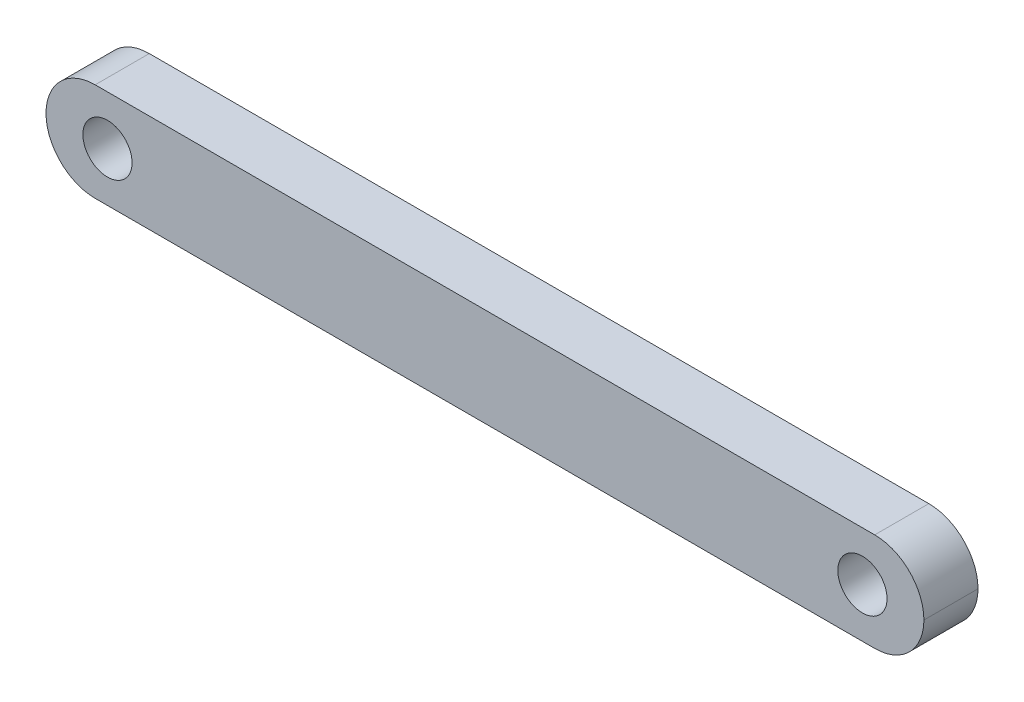
ISO-10303-21;
HEADER;
FILE_DESCRIPTION(('STEP AP214'),'2;1');
FILE_NAME('part.step','',(''),(''),'','','');
FILE_SCHEMA(('AUTOMOTIVE_DESIGN { 1 0 10303 214 1 1 1 1 }'));
ENDSEC;
DATA;
#1=APPLICATION_CONTEXT('core data for automotive mechanical design processes');
#2=APPLICATION_PROTOCOL_DEFINITION('international standard','automotive_design',2000,#1);
#3=PRODUCT_CONTEXT('',#1,'mechanical');
#4=PRODUCT('Part','Part','',(#3));
#5=PRODUCT_RELATED_PRODUCT_CATEGORY('part','',(#4));
#6=PRODUCT_DEFINITION_FORMATION('','',#4);
#7=PRODUCT_DEFINITION_CONTEXT('part definition',#1,'design');
#8=PRODUCT_DEFINITION('design','',#6,#7);
#9=PRODUCT_DEFINITION_SHAPE('','',#8);
#10=(LENGTH_UNIT() NAMED_UNIT(*) SI_UNIT(.MILLI.,.METRE.));
#11=(NAMED_UNIT(*) PLANE_ANGLE_UNIT() SI_UNIT($,.RADIAN.));
#12=(NAMED_UNIT(*) SI_UNIT($,.STERADIAN.) SOLID_ANGLE_UNIT());
#13=UNCERTAINTY_MEASURE_WITH_UNIT(LENGTH_MEASURE(1.E-05),#10,'distance_accuracy_value','');
#14=(GEOMETRIC_REPRESENTATION_CONTEXT(3) GLOBAL_UNCERTAINTY_ASSIGNED_CONTEXT((#13)) GLOBAL_UNIT_ASSIGNED_CONTEXT((#10,
#11,#12)) REPRESENTATION_CONTEXT('',''));
#15=CARTESIAN_POINT('',(0.,0.,0.));
#16=DIRECTION('',(0.,0.,1.));
#17=DIRECTION('',(1.,0.,0.));
#18=AXIS2_PLACEMENT_3D('',#15,#16,#17);
#19=CARTESIAN_POINT('',(0.,0.,2.2));
#20=DIRECTION('',(0.,0.,1.));
#21=DIRECTION('',(1.,0.,0.));
#22=AXIS2_PLACEMENT_3D('',#19,#20,#21);
#23=PLANE('',#22);
#24=CARTESIAN_POINT('',(-59.8477644666667,10.4166666666667,2.2));
#25=DIRECTION('',(0.,0.,1.));
#26=DIRECTION('',(1.,0.,0.));
#27=AXIS2_PLACEMENT_3D('',#24,#25,#26);
#28=CIRCLE('',#27,0.999999999999998);
#29=CARTESIAN_POINT('',(-58.8477644666667,10.4166666666667,2.2));
#30=VERTEX_POINT('',#29);
#31=EDGE_CURVE('E125',#30,#30,#28,.T.);
#32=ORIENTED_EDGE('',*,*,#31,.F.);
#33=EDGE_LOOP('',(#32));
#34=FACE_BOUND('',#33,.T.);
#35=CARTESIAN_POINT('',(-60.3477644666667,10.4166666666667,2.2));
#36=DIRECTION('',(0.,0.,1.));
#37=DIRECTION('',(1.,0.,0.));
#38=AXIS2_PLACEMENT_3D('',#35,#36,#37);
#39=CIRCLE('',#38,2.);
#40=CARTESIAN_POINT('',(-60.3477644666667,12.4166666666667,2.2));
#41=VERTEX_POINT('',#40);
#42=CARTESIAN_POINT('',(-62.3477644666667,10.4166666666667,2.2));
#43=VERTEX_POINT('',#42);
#44=EDGE_CURVE('E63',#41,#43,#39,.T.);
#45=ORIENTED_EDGE('',*,*,#44,.T.);
#46=CARTESIAN_POINT('',(-60.3477644666667,10.4166666666667,2.2));
#47=DIRECTION('',(0.,0.,1.));
#48=DIRECTION('',(1.,0.,0.));
#49=AXIS2_PLACEMENT_3D('',#46,#47,#48);
#50=CIRCLE('',#49,2.);
#51=CARTESIAN_POINT('',(-60.3477644666667,8.41666666666667,2.2));
#52=VERTEX_POINT('',#51);
#53=EDGE_CURVE('E136',#43,#52,#50,.T.);
#54=ORIENTED_EDGE('',*,*,#53,.T.);
#55=DIRECTION('',(1.,0.,0.));
#56=VECTOR('',#55,1.);
#57=CARTESIAN_POINT('',(-62.3477644666667,8.41666666666667,2.2));
#58=LINE('',#57,#56);
#59=CARTESIAN_POINT('',(-28.6477644666667,8.41666666666667,2.2));
#60=VERTEX_POINT('',#59);
#61=EDGE_CURVE('E112',#52,#60,#58,.T.);
#62=ORIENTED_EDGE('',*,*,#61,.T.);
#63=CARTESIAN_POINT('',(-28.6477644666667,10.4166666666667,2.2));
#64=DIRECTION('',(0.,0.,1.));
#65=DIRECTION('',(1.,0.,0.));
#66=AXIS2_PLACEMENT_3D('',#63,#64,#65);
#67=CIRCLE('',#66,2.);
#68=CARTESIAN_POINT('',(-26.6477644666667,10.4166666666667,2.2));
#69=VERTEX_POINT('',#68);
#70=EDGE_CURVE('E56',#60,#69,#67,.T.);
#71=ORIENTED_EDGE('',*,*,#70,.T.);
#72=CARTESIAN_POINT('',(-28.6477644666667,10.4166666666667,2.2));
#73=DIRECTION('',(0.,0.,1.));
#74=DIRECTION('',(1.,0.,0.));
#75=AXIS2_PLACEMENT_3D('',#72,#73,#74);
#76=CIRCLE('',#75,2.);
#77=CARTESIAN_POINT('',(-28.6477644666667,12.4166666666667,2.2));
#78=VERTEX_POINT('',#77);
#79=EDGE_CURVE('E102',#69,#78,#76,.T.);
#80=ORIENTED_EDGE('',*,*,#79,.T.);
#81=DIRECTION('',(-1.,0.,0.));
#82=VECTOR('',#81,1.);
#83=CARTESIAN_POINT('',(-26.6477644666667,12.4166666666667,2.2));
#84=LINE('',#83,#82);
#85=EDGE_CURVE('E120',#78,#41,#84,.T.);
#86=ORIENTED_EDGE('',*,*,#85,.T.);
#87=EDGE_LOOP('',(#45,#54,#62,#71,#80,#86));
#88=FACE_BOUND('',#87,.T.);
#89=CARTESIAN_POINT('',(-29.1477644666667,10.4166666666667,2.2));
#90=DIRECTION('',(0.,0.,1.));
#91=DIRECTION('',(1.,0.,0.));
#92=AXIS2_PLACEMENT_3D('',#89,#90,#91);
#93=CIRCLE('',#92,1.);
#94=CARTESIAN_POINT('',(-28.1477644666667,10.4166666666667,2.2));
#95=VERTEX_POINT('',#94);
#96=EDGE_CURVE('E140',#95,#95,#93,.T.);
#97=ORIENTED_EDGE('',*,*,#96,.F.);
#98=EDGE_LOOP('',(#97));
#99=FACE_BOUND('',#98,.T.);
#100=ADVANCED_FACE('F39',(#34,#88,#99),#23,.T.);
#101=CARTESIAN_POINT('',(0.,0.,0.));
#102=DIRECTION('',(0.,0.,1.));
#103=DIRECTION('',(1.,0.,0.));
#104=AXIS2_PLACEMENT_3D('',#101,#102,#103);
#105=PLANE('',#104);
#106=DIRECTION('',(1.,0.,0.));
#107=VECTOR('',#106,1.);
#108=CARTESIAN_POINT('',(-62.3477644666667,8.41666666666667,0.));
#109=LINE('',#108,#107);
#110=CARTESIAN_POINT('',(-60.3477644666667,8.41666666666667,0.));
#111=VERTEX_POINT('',#110);
#112=CARTESIAN_POINT('',(-28.6477644666667,8.41666666666667,0.));
#113=VERTEX_POINT('',#112);
#114=EDGE_CURVE('E110',#111,#113,#109,.T.);
#115=ORIENTED_EDGE('',*,*,#114,.F.);
#116=CARTESIAN_POINT('',(-60.3477644666667,10.4166666666667,0.));
#117=DIRECTION('',(0.,0.,1.));
#118=DIRECTION('',(1.,0.,0.));
#119=AXIS2_PLACEMENT_3D('',#116,#117,#118);
#120=CIRCLE('',#119,2.);
#121=CARTESIAN_POINT('',(-62.3477644666667,10.4166666666667,0.));
#122=VERTEX_POINT('',#121);
#123=EDGE_CURVE('E93',#111,#122,#120,.F.);
#124=ORIENTED_EDGE('',*,*,#123,.T.);
#125=CARTESIAN_POINT('',(-60.3477644666667,10.4166666666667,0.));
#126=DIRECTION('',(0.,0.,1.));
#127=DIRECTION('',(1.,0.,0.));
#128=AXIS2_PLACEMENT_3D('',#125,#126,#127);
#129=CIRCLE('',#128,2.);
#130=CARTESIAN_POINT('',(-60.3477644666667,12.4166666666667,0.));
#131=VERTEX_POINT('',#130);
#132=EDGE_CURVE('E103',#122,#131,#129,.F.);
#133=ORIENTED_EDGE('',*,*,#132,.T.);
#134=DIRECTION('',(-1.,0.,0.));
#135=VECTOR('',#134,1.);
#136=CARTESIAN_POINT('',(-26.6477644666667,12.4166666666667,0.));
#137=LINE('',#136,#135);
#138=CARTESIAN_POINT('',(-28.6477644666667,12.4166666666667,0.));
#139=VERTEX_POINT('',#138);
#140=EDGE_CURVE('E121',#139,#131,#137,.T.);
#141=ORIENTED_EDGE('',*,*,#140,.F.);
#142=CARTESIAN_POINT('',(-28.6477644666667,10.4166666666667,0.));
#143=DIRECTION('',(0.,0.,1.));
#144=DIRECTION('',(1.,0.,0.));
#145=AXIS2_PLACEMENT_3D('',#142,#143,#144);
#146=CIRCLE('',#145,2.);
#147=CARTESIAN_POINT('',(-26.6477644666667,10.4166666666667,0.));
#148=VERTEX_POINT('',#147);
#149=EDGE_CURVE('E113',#139,#148,#146,.F.);
#150=ORIENTED_EDGE('',*,*,#149,.T.);
#151=CARTESIAN_POINT('',(-28.6477644666667,10.4166666666667,0.));
#152=DIRECTION('',(0.,0.,1.));
#153=DIRECTION('',(1.,0.,0.));
#154=AXIS2_PLACEMENT_3D('',#151,#152,#153);
#155=CIRCLE('',#154,2.);
#156=EDGE_CURVE('E119',#148,#113,#155,.F.);
#157=ORIENTED_EDGE('',*,*,#156,.T.);
#158=EDGE_LOOP('',(#115,#124,#133,#141,#150,#157));
#159=FACE_BOUND('',#158,.T.);
#160=CARTESIAN_POINT('',(-59.8477644666667,10.4166666666667,0.));
#161=DIRECTION('',(0.,0.,1.));
#162=DIRECTION('',(1.,0.,0.));
#163=AXIS2_PLACEMENT_3D('',#160,#161,#162);
#164=CIRCLE('',#163,0.999999999999998);
#165=CARTESIAN_POINT('',(-58.8477644666667,10.4166666666667,0.));
#166=VERTEX_POINT('',#165);
#167=EDGE_CURVE('E158',#166,#166,#164,.T.);
#168=ORIENTED_EDGE('',*,*,#167,.T.);
#169=EDGE_LOOP('',(#168));
#170=FACE_BOUND('',#169,.T.);
#171=CARTESIAN_POINT('',(-29.1477644666667,10.4166666666667,0.));
#172=DIRECTION('',(0.,0.,1.));
#173=DIRECTION('',(1.,0.,0.));
#174=AXIS2_PLACEMENT_3D('',#171,#172,#173);
#175=CIRCLE('',#174,1.);
#176=CARTESIAN_POINT('',(-28.1477644666667,10.4166666666667,0.));
#177=VERTEX_POINT('',#176);
#178=EDGE_CURVE('E138',#177,#177,#175,.T.);
#179=ORIENTED_EDGE('',*,*,#178,.T.);
#180=EDGE_LOOP('',(#179));
#181=FACE_BOUND('',#180,.T.);
#182=ADVANCED_FACE('F116',(#159,#170,#181),#105,.F.);
#183=CARTESIAN_POINT('',(-26.6477644666667,12.4166666666667,2.2));
#184=DIRECTION('',(0.,-1.,0.));
#185=DIRECTION('',(1.,0.,0.));
#186=AXIS2_PLACEMENT_3D('',#183,#184,#185);
#187=PLANE('',#186);
#188=ORIENTED_EDGE('',*,*,#140,.T.);
#189=DIRECTION('',(0.,0.,-1.));
#190=VECTOR('',#189,1.);
#191=CARTESIAN_POINT('',(-60.3477644666667,12.4166666666667,2.2));
#192=LINE('',#191,#190);
#193=EDGE_CURVE('E11',#131,#41,#192,.F.);
#194=ORIENTED_EDGE('',*,*,#193,.T.);
#195=ORIENTED_EDGE('',*,*,#85,.F.);
#196=DIRECTION('',(0.,0.,-1.));
#197=VECTOR('',#196,1.);
#198=CARTESIAN_POINT('',(-28.6477644666667,12.4166666666667,2.2));
#199=LINE('',#198,#197);
#200=EDGE_CURVE('E48',#78,#139,#199,.T.);
#201=ORIENTED_EDGE('',*,*,#200,.T.);
#202=EDGE_LOOP('',(#188,#194,#195,#201));
#203=FACE_BOUND('',#202,.T.);
#204=ADVANCED_FACE('F152',(#203),#187,.F.);
#205=CARTESIAN_POINT('',(-62.3477644666667,8.41666666666667,2.2));
#206=DIRECTION('',(0.,1.,0.));
#207=DIRECTION('',(-1.,0.,0.));
#208=AXIS2_PLACEMENT_3D('',#205,#206,#207);
#209=PLANE('',#208);
#210=ORIENTED_EDGE('',*,*,#61,.F.);
#211=DIRECTION('',(0.,0.,-1.));
#212=VECTOR('',#211,1.);
#213=CARTESIAN_POINT('',(-60.3477644666667,8.41666666666667,2.2));
#214=LINE('',#213,#212);
#215=EDGE_CURVE('E97',#52,#111,#214,.T.);
#216=ORIENTED_EDGE('',*,*,#215,.T.);
#217=ORIENTED_EDGE('',*,*,#114,.T.);
#218=DIRECTION('',(0.,0.,-1.));
#219=VECTOR('',#218,1.);
#220=CARTESIAN_POINT('',(-28.6477644666667,8.41666666666667,2.2));
#221=LINE('',#220,#219);
#222=EDGE_CURVE('E114',#113,#60,#221,.F.);
#223=ORIENTED_EDGE('',*,*,#222,.T.);
#224=EDGE_LOOP('',(#210,#216,#217,#223));
#225=FACE_BOUND('',#224,.T.);
#226=ADVANCED_FACE('F108',(#225),#209,.F.);
#227=CARTESIAN_POINT('',(-59.8477644666667,10.4166666666667,2.2));
#228=DIRECTION('',(0.,0.,-1.));
#229=DIRECTION('',(-1.,0.,0.));
#230=AXIS2_PLACEMENT_3D('',#227,#228,#229);
#231=CYLINDRICAL_SURFACE('',#230,0.999999999999998);
#232=ORIENTED_EDGE('',*,*,#31,.T.);
#233=EDGE_LOOP('',(#232));
#234=FACE_BOUND('',#233,.T.);
#235=ORIENTED_EDGE('',*,*,#167,.F.);
#236=EDGE_LOOP('',(#235));
#237=FACE_BOUND('',#236,.T.);
#238=ADVANCED_FACE('F178',(#234,#237),#231,.F.);
#239=CARTESIAN_POINT('',(-29.1477644666667,10.4166666666667,2.2));
#240=DIRECTION('',(0.,0.,-1.));
#241=DIRECTION('',(-1.,0.,0.));
#242=AXIS2_PLACEMENT_3D('',#239,#240,#241);
#243=CYLINDRICAL_SURFACE('',#242,1.);
#244=ORIENTED_EDGE('',*,*,#96,.T.);
#245=EDGE_LOOP('',(#244));
#246=FACE_BOUND('',#245,.T.);
#247=ORIENTED_EDGE('',*,*,#178,.F.);
#248=EDGE_LOOP('',(#247));
#249=FACE_BOUND('',#248,.T.);
#250=ADVANCED_FACE('F166',(#246,#249),#243,.F.);
#251=CARTESIAN_POINT('',(-60.3477644666667,10.4166666666667,2.2));
#252=DIRECTION('',(0.,0.,-1.));
#253=DIRECTION('',(-1.,0.,0.));
#254=AXIS2_PLACEMENT_3D('',#251,#252,#253);
#255=CYLINDRICAL_SURFACE('',#254,2.);
#256=DIRECTION('',(0.,0.,-1.));
#257=VECTOR('',#256,1.);
#258=CARTESIAN_POINT('',(-62.3477644666667,10.4166666666667,2.2));
#259=LINE('',#258,#257);
#260=EDGE_CURVE('E98',#43,#122,#259,.T.);
#261=ORIENTED_EDGE('',*,*,#260,.F.);
#262=ORIENTED_EDGE('',*,*,#44,.F.);
#263=ORIENTED_EDGE('',*,*,#193,.F.);
#264=ORIENTED_EDGE('',*,*,#132,.F.);
#265=EDGE_LOOP('',(#261,#262,#263,#264));
#266=FACE_BOUND('',#265,.T.);
#267=ADVANCED_FACE('F156',(#266),#255,.T.);
#268=CARTESIAN_POINT('',(-60.3477644666667,10.4166666666667,2.2));
#269=DIRECTION('',(0.,0.,-1.));
#270=DIRECTION('',(-1.,0.,0.));
#271=AXIS2_PLACEMENT_3D('',#268,#269,#270);
#272=CYLINDRICAL_SURFACE('',#271,2.);
#273=ORIENTED_EDGE('',*,*,#53,.F.);
#274=ORIENTED_EDGE('',*,*,#260,.T.);
#275=ORIENTED_EDGE('',*,*,#123,.F.);
#276=ORIENTED_EDGE('',*,*,#215,.F.);
#277=EDGE_LOOP('',(#273,#274,#275,#276));
#278=FACE_BOUND('',#277,.T.);
#279=ADVANCED_FACE('F96',(#278),#272,.T.);
#280=CARTESIAN_POINT('',(-28.6477644666667,10.4166666666667,2.2));
#281=DIRECTION('',(0.,0.,-1.));
#282=DIRECTION('',(-1.,0.,0.));
#283=AXIS2_PLACEMENT_3D('',#280,#281,#282);
#284=CYLINDRICAL_SURFACE('',#283,2.);
#285=ORIENTED_EDGE('',*,*,#200,.F.);
#286=ORIENTED_EDGE('',*,*,#79,.F.);
#287=DIRECTION('',(0.,0.,-1.));
#288=VECTOR('',#287,1.);
#289=CARTESIAN_POINT('',(-26.6477644666667,10.4166666666667,2.2));
#290=LINE('',#289,#288);
#291=EDGE_CURVE('E43',#148,#69,#290,.F.);
#292=ORIENTED_EDGE('',*,*,#291,.F.);
#293=ORIENTED_EDGE('',*,*,#149,.F.);
#294=EDGE_LOOP('',(#285,#286,#292,#293));
#295=FACE_BOUND('',#294,.T.);
#296=ADVANCED_FACE('F41',(#295),#284,.T.);
#297=CARTESIAN_POINT('',(-28.6477644666667,10.4166666666667,2.2));
#298=DIRECTION('',(0.,0.,-1.));
#299=DIRECTION('',(-1.,0.,0.));
#300=AXIS2_PLACEMENT_3D('',#297,#298,#299);
#301=CYLINDRICAL_SURFACE('',#300,2.);
#302=ORIENTED_EDGE('',*,*,#70,.F.);
#303=ORIENTED_EDGE('',*,*,#222,.F.);
#304=ORIENTED_EDGE('',*,*,#156,.F.);
#305=ORIENTED_EDGE('',*,*,#291,.T.);
#306=EDGE_LOOP('',(#302,#303,#304,#305));
#307=FACE_BOUND('',#306,.T.);
#308=ADVANCED_FACE('F145',(#307),#301,.T.);
#309=CLOSED_SHELL('',(#100,#182,#204,#226,#238,#250,#267,#279,#296,#308));
#310=MANIFOLD_SOLID_BREP('B2',#309);
#311=ADVANCED_BREP_SHAPE_REPRESENTATION('',(#18,#310),#14);
#312=SHAPE_DEFINITION_REPRESENTATION(#9,#311);
ENDSEC;
END-ISO-10303-21;
